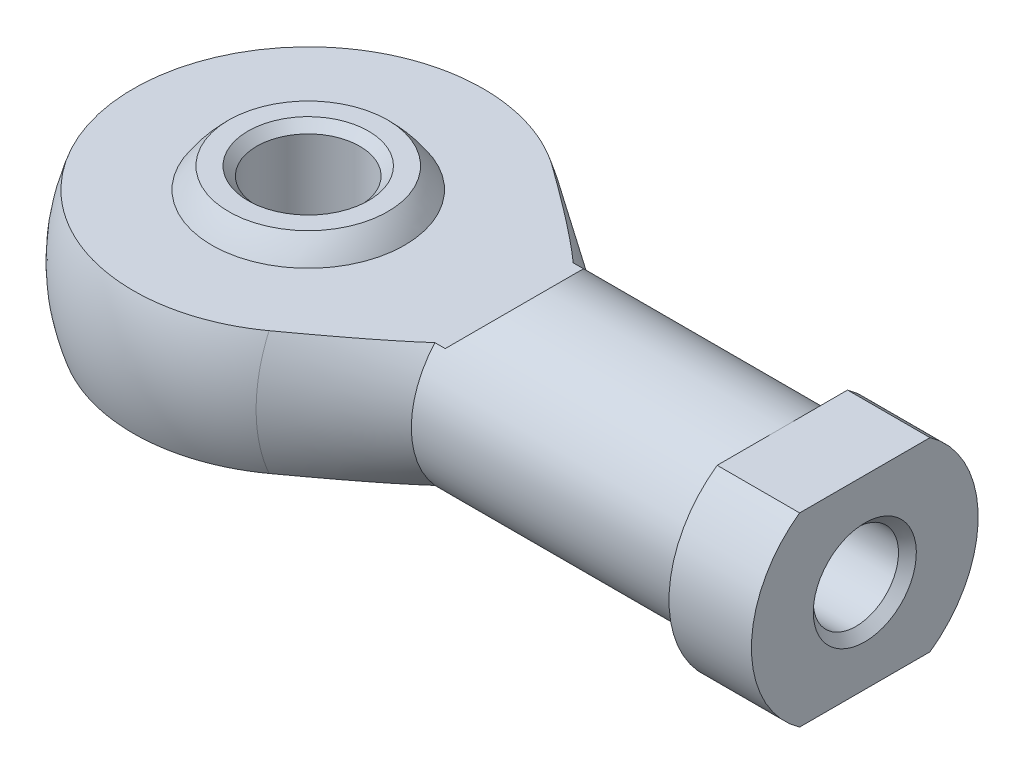
ISO-10303-21;
HEADER;
FILE_DESCRIPTION(('STEP AP214'),'2;1');
FILE_NAME('part.step','',(''),(''),'','','');
FILE_SCHEMA(('AUTOMOTIVE_DESIGN { 1 0 10303 214 1 1 1 1 }'));
ENDSEC;
DATA;
#1=APPLICATION_CONTEXT('core data for automotive mechanical design processes');
#2=APPLICATION_PROTOCOL_DEFINITION('international standard','automotive_design',2000,#1);
#3=PRODUCT_CONTEXT('',#1,'mechanical');
#4=PRODUCT('Part','Part','',(#3));
#5=PRODUCT_RELATED_PRODUCT_CATEGORY('part','',(#4));
#6=PRODUCT_DEFINITION_FORMATION('','',#4);
#7=PRODUCT_DEFINITION_CONTEXT('part definition',#1,'design');
#8=PRODUCT_DEFINITION('design','',#6,#7);
#9=PRODUCT_DEFINITION_SHAPE('','',#8);
#10=(LENGTH_UNIT() NAMED_UNIT(*) SI_UNIT(.MILLI.,.METRE.));
#11=(NAMED_UNIT(*) PLANE_ANGLE_UNIT() SI_UNIT($,.RADIAN.));
#12=(NAMED_UNIT(*) SI_UNIT($,.STERADIAN.) SOLID_ANGLE_UNIT());
#13=UNCERTAINTY_MEASURE_WITH_UNIT(LENGTH_MEASURE(1.E-05),#10,'distance_accuracy_value','');
#14=(GEOMETRIC_REPRESENTATION_CONTEXT(3) GLOBAL_UNCERTAINTY_ASSIGNED_CONTEXT((#13)) GLOBAL_UNIT_ASSIGNED_CONTEXT((#10,
#11,#12)) REPRESENTATION_CONTEXT('',''));
#15=CARTESIAN_POINT('',(0.,0.,0.));
#16=DIRECTION('',(0.,0.,1.));
#17=DIRECTION('',(1.,0.,0.));
#18=AXIS2_PLACEMENT_3D('',#15,#16,#17);
#19=CARTESIAN_POINT('',(16.25,0.,0.));
#20=DIRECTION('',(-1.,0.,0.));
#21=DIRECTION('',(0.,1.,0.));
#22=AXIS2_PLACEMENT_3D('',#19,#20,#21);
#23=CYLINDRICAL_SURFACE('',#22,4.5);
#24=CARTESIAN_POINT('',(7.,0.,0.));
#25=DIRECTION('',(0.707106781186547,0.707106781186548,0.));
#26=DIRECTION('',(-0.707106781186548,0.707106781186547,0.));
#27=AXIS2_PLACEMENT_3D('',#24,#25,#26);
#28=ELLIPSE('',#27,6.36396103067893,4.5);
#29=CARTESIAN_POINT('',(10.,-3.,3.35410196624968));
#30=VERTEX_POINT('',#29);
#31=CARTESIAN_POINT('',(10.,-3.,-3.35410196624968));
#32=VERTEX_POINT('',#31);
#33=EDGE_CURVE('E11',#30,#32,#28,.T.);
#34=ORIENTED_EDGE('',*,*,#33,.T.);
#35=DIRECTION('',(-1.,0.,0.));
#36=VECTOR('',#35,1.);
#37=CARTESIAN_POINT('',(9.74999999999984,-3.,-3.35410196624968));
#38=LINE('',#37,#36);
#39=CARTESIAN_POINT('',(9.5,-3.,-3.35410196624968));
#40=VERTEX_POINT('',#39);
#41=EDGE_CURVE('E27',#32,#40,#38,.T.);
#42=ORIENTED_EDGE('',*,*,#41,.T.);
#43=CARTESIAN_POINT('',(9.5,0.,0.));
#44=DIRECTION('',(-1.,0.,0.));
#45=DIRECTION('',(0.,1.,0.));
#46=AXIS2_PLACEMENT_3D('',#43,#44,#45);
#47=CIRCLE('',#46,4.5);
#48=CARTESIAN_POINT('',(9.5,3.,-3.35410196624968));
#49=VERTEX_POINT('',#48);
#50=EDGE_CURVE('E276',#49,#40,#47,.T.);
#51=ORIENTED_EDGE('',*,*,#50,.F.);
#52=DIRECTION('',(1.,0.,0.));
#53=VECTOR('',#52,1.);
#54=CARTESIAN_POINT('',(9.74999999999984,3.,-3.35410196624968));
#55=LINE('',#54,#53);
#56=CARTESIAN_POINT('',(10.,3.,-3.35410196624968));
#57=VERTEX_POINT('',#56);
#58=EDGE_CURVE('E277',#49,#57,#55,.T.);
#59=ORIENTED_EDGE('',*,*,#58,.T.);
#60=CARTESIAN_POINT('',(7.,0.,0.));
#61=DIRECTION('',(0.707106781186547,-0.707106781186548,0.));
#62=DIRECTION('',(0.707106781186548,0.707106781186547,0.));
#63=AXIS2_PLACEMENT_3D('',#60,#61,#62);
#64=ELLIPSE('',#63,6.36396103067893,4.5);
#65=CARTESIAN_POINT('',(10.,3.,3.35410196624968));
#66=VERTEX_POINT('',#65);
#67=EDGE_CURVE('E284',#57,#66,#64,.T.);
#68=ORIENTED_EDGE('',*,*,#67,.T.);
#69=DIRECTION('',(-1.,0.,0.));
#70=VECTOR('',#69,1.);
#71=CARTESIAN_POINT('',(9.74999999999984,3.,3.35410196624968));
#72=LINE('',#71,#70);
#73=CARTESIAN_POINT('',(9.5,3.,3.35410196624968));
#74=VERTEX_POINT('',#73);
#75=EDGE_CURVE('E166',#66,#74,#72,.T.);
#76=ORIENTED_EDGE('',*,*,#75,.T.);
#77=CARTESIAN_POINT('',(9.5,0.,0.));
#78=DIRECTION('',(-1.,0.,0.));
#79=DIRECTION('',(0.,1.,0.));
#80=AXIS2_PLACEMENT_3D('',#77,#78,#79);
#81=CIRCLE('',#80,4.5);
#82=CARTESIAN_POINT('',(9.5,-3.,3.35410196624968));
#83=VERTEX_POINT('',#82);
#84=EDGE_CURVE('E163',#83,#74,#81,.T.);
#85=ORIENTED_EDGE('',*,*,#84,.F.);
#86=DIRECTION('',(1.,0.,0.));
#87=VECTOR('',#86,1.);
#88=CARTESIAN_POINT('',(9.74999999999984,-3.,3.35410196624968));
#89=LINE('',#88,#87);
#90=EDGE_CURVE('E158',#83,#30,#89,.T.);
#91=ORIENTED_EDGE('',*,*,#90,.T.);
#92=EDGE_LOOP('',(#34,#42,#51,#59,#68,#76,#85,#91));
#93=FACE_BOUND('',#92,.T.);
#94=CARTESIAN_POINT('',(23.,0.,0.));
#95=DIRECTION('',(-1.,0.,0.));
#96=DIRECTION('',(0.,1.,0.));
#97=AXIS2_PLACEMENT_3D('',#94,#95,#96);
#98=CIRCLE('',#97,4.5);
#99=CARTESIAN_POINT('',(23.,4.5,0.));
#100=VERTEX_POINT('',#99);
#101=CARTESIAN_POINT('',(23.,-4.5,0.));
#102=VERTEX_POINT('',#101);
#103=EDGE_CURVE('E181',#100,#102,#98,.T.);
#104=ORIENTED_EDGE('',*,*,#103,.T.);
#105=CARTESIAN_POINT('',(23.,0.,0.));
#106=DIRECTION('',(-1.,0.,0.));
#107=DIRECTION('',(0.,1.,0.));
#108=AXIS2_PLACEMENT_3D('',#105,#106,#107);
#109=CIRCLE('',#108,4.5);
#110=EDGE_CURVE('E336',#102,#100,#109,.T.);
#111=ORIENTED_EDGE('',*,*,#110,.T.);
#112=EDGE_LOOP('',(#104,#111));
#113=FACE_BOUND('',#112,.T.);
#114=ADVANCED_FACE('F16',(#93,#113),#23,.T.);
#115=CARTESIAN_POINT('',(0.,0.,0.));
#116=DIRECTION('',(0.,0.,1.));
#117=DIRECTION('',(1.,0.,0.));
#118=AXIS2_PLACEMENT_3D('',#115,#116,#117);
#119=SPHERICAL_SURFACE('',#118,9.);
#120=CARTESIAN_POINT('',(4.97311036247235,0.,0.));
#121=DIRECTION('',(-1.,0.,0.));
#122=DIRECTION('',(0.,1.,0.));
#123=AXIS2_PLACEMENT_3D('',#120,#121,#122);
#124=CIRCLE('',#123,7.50121145700282);
#125=CARTESIAN_POINT('',(4.97311036247235,3.,-6.87518533005986));
#126=VERTEX_POINT('',#125);
#127=CARTESIAN_POINT('',(4.97311036247235,-3.,-6.87518533005986));
#128=VERTEX_POINT('',#127);
#129=EDGE_CURVE('E340',#126,#128,#124,.T.);
#130=ORIENTED_EDGE('',*,*,#129,.T.);
#131=CARTESIAN_POINT('',(0.,-3.,0.));
#132=DIRECTION('',(0.,1.,0.));
#133=DIRECTION('',(0.,0.,-1.));
#134=AXIS2_PLACEMENT_3D('',#131,#132,#133);
#135=CIRCLE('',#134,8.48528137423858);
#136=CARTESIAN_POINT('',(4.97311036247235,-3.,6.87518533005986));
#137=VERTEX_POINT('',#136);
#138=EDGE_CURVE('E217',#128,#137,#135,.T.);
#139=ORIENTED_EDGE('',*,*,#138,.T.);
#140=CARTESIAN_POINT('',(4.97311036247235,0.,0.));
#141=DIRECTION('',(-1.,0.,0.));
#142=DIRECTION('',(0.,1.,0.));
#143=AXIS2_PLACEMENT_3D('',#140,#141,#142);
#144=CIRCLE('',#143,7.50121145700282);
#145=CARTESIAN_POINT('',(4.97311036247235,3.,6.87518533005986));
#146=VERTEX_POINT('',#145);
#147=EDGE_CURVE('E185',#137,#146,#144,.T.);
#148=ORIENTED_EDGE('',*,*,#147,.T.);
#149=CARTESIAN_POINT('',(0.,3.,0.));
#150=DIRECTION('',(0.,-1.,0.));
#151=DIRECTION('',(0.,0.,1.));
#152=AXIS2_PLACEMENT_3D('',#149,#150,#151);
#153=CIRCLE('',#152,8.48528137423858);
#154=EDGE_CURVE('E218',#146,#126,#153,.T.);
#155=ORIENTED_EDGE('',*,*,#154,.T.);
#156=EDGE_LOOP('',(#130,#139,#148,#155));
#157=FACE_BOUND('',#156,.T.);
#158=ADVANCED_FACE('F388',(#157),#119,.T.);
#159=CARTESIAN_POINT('',(0.,-3.78786796564404,0.));
#160=DIRECTION('',(0.,-1.,0.));
#161=DIRECTION('',(1.,0.,0.));
#162=AXIS2_PLACEMENT_3D('',#159,#160,#161);
#163=CONICAL_SURFACE('',#162,2.71213203435596,0.785398163397448);
#164=CARTESIAN_POINT('',(0.,-3.57573593128807,0.));
#165=DIRECTION('',(0.,1.,0.));
#166=DIRECTION('',(1.,0.,0.));
#167=AXIS2_PLACEMENT_3D('',#164,#165,#166);
#168=CIRCLE('',#167,2.5);
#169=CARTESIAN_POINT('',(-2.5,-3.57573593128807,0.));
#170=VERTEX_POINT('',#169);
#171=EDGE_CURVE('E310',#170,#170,#168,.T.);
#172=ORIENTED_EDGE('',*,*,#171,.T.);
#173=EDGE_LOOP('',(#172));
#174=FACE_BOUND('',#173,.T.);
#175=CARTESIAN_POINT('',(0.,-4.,0.));
#176=DIRECTION('',(0.,1.,0.));
#177=DIRECTION('',(1.,0.,0.));
#178=AXIS2_PLACEMENT_3D('',#175,#176,#177);
#179=CIRCLE('',#178,2.92426406871193);
#180=CARTESIAN_POINT('',(-2.92426406871193,-4.,0.));
#181=VERTEX_POINT('',#180);
#182=EDGE_CURVE('E269',#181,#181,#179,.T.);
#183=ORIENTED_EDGE('',*,*,#182,.F.);
#184=EDGE_LOOP('',(#183));
#185=FACE_BOUND('',#184,.T.);
#186=ADVANCED_FACE('F383',(#174,#185),#163,.F.);
#187=CARTESIAN_POINT('',(0.,0.,0.));
#188=DIRECTION('',(0.,1.,0.));
#189=DIRECTION('',(1.,0.,0.));
#190=AXIS2_PLACEMENT_3D('',#187,#188,#189);
#191=CYLINDRICAL_SURFACE('',#190,2.5);
#192=CARTESIAN_POINT('',(0.,3.57573593128807,0.));
#193=DIRECTION('',(0.,1.,0.));
#194=DIRECTION('',(1.,0.,0.));
#195=AXIS2_PLACEMENT_3D('',#192,#193,#194);
#196=CIRCLE('',#195,2.5);
#197=CARTESIAN_POINT('',(-2.5,3.57573593128807,0.));
#198=VERTEX_POINT('',#197);
#199=EDGE_CURVE('E255',#198,#198,#196,.T.);
#200=ORIENTED_EDGE('',*,*,#199,.T.);
#201=EDGE_LOOP('',(#200));
#202=FACE_BOUND('',#201,.T.);
#203=ORIENTED_EDGE('',*,*,#171,.F.);
#204=EDGE_LOOP('',(#203));
#205=FACE_BOUND('',#204,.T.);
#206=ADVANCED_FACE('F367',(#202,#205),#191,.F.);
#207=CARTESIAN_POINT('',(0.,3.78786796564403,0.));
#208=DIRECTION('',(0.,1.,0.));
#209=DIRECTION('',(1.,0.,0.));
#210=AXIS2_PLACEMENT_3D('',#207,#208,#209);
#211=CONICAL_SURFACE('',#210,2.71213203435596,0.785398163397449);
#212=CARTESIAN_POINT('',(0.,4.,0.));
#213=DIRECTION('',(0.,1.,0.));
#214=DIRECTION('',(1.,0.,0.));
#215=AXIS2_PLACEMENT_3D('',#212,#213,#214);
#216=CIRCLE('',#215,2.92426406871192);
#217=CARTESIAN_POINT('',(-2.92426406871192,4.,0.));
#218=VERTEX_POINT('',#217);
#219=EDGE_CURVE('E223',#218,#218,#216,.T.);
#220=ORIENTED_EDGE('',*,*,#219,.T.);
#221=EDGE_LOOP('',(#220));
#222=FACE_BOUND('',#221,.T.);
#223=ORIENTED_EDGE('',*,*,#199,.F.);
#224=EDGE_LOOP('',(#223));
#225=FACE_BOUND('',#224,.T.);
#226=ADVANCED_FACE('F370',(#222,#225),#211,.F.);
#227=CARTESIAN_POINT('',(13.4033084967925,0.,0.));
#228=DIRECTION('',(1.,0.,0.));
#229=DIRECTION('',(0.,1.,0.));
#230=AXIS2_PLACEMENT_3D('',#227,#228,#229);
#231=CONICAL_SURFACE('',#230,1.0335,1.0471975511966);
#232=CARTESIAN_POINT('',(14.,0.,0.));
#233=DIRECTION('',(-1.,0.,0.));
#234=DIRECTION('',(0.,1.,0.));
#235=AXIS2_PLACEMENT_3D('',#232,#233,#234);
#236=CIRCLE('',#235,2.067);
#237=CARTESIAN_POINT('',(14.,2.067,0.));
#238=VERTEX_POINT('',#237);
#239=EDGE_CURVE('E219',#238,#238,#236,.T.);
#240=ORIENTED_EDGE('',*,*,#239,.F.);
#241=EDGE_LOOP('',(#240));
#242=FACE_BOUND('',#241,.T.);
#243=CARTESIAN_POINT('',(12.806616993585,0.,0.));
#244=VERTEX_POINT('',#243);
#245=VERTEX_LOOP('',#244);
#246=FACE_BOUND('',#245,.T.);
#247=ADVANCED_FACE('F372',(#242,#246),#231,.F.);
#248=CARTESIAN_POINT('',(20.2835,0.,0.));
#249=DIRECTION('',(-1.,0.,0.));
#250=DIRECTION('',(0.,1.,0.));
#251=AXIS2_PLACEMENT_3D('',#248,#249,#250);
#252=CYLINDRICAL_SURFACE('',#251,2.067);
#253=CARTESIAN_POINT('',(26.567,0.,0.));
#254=DIRECTION('',(-1.,0.,0.));
#255=DIRECTION('',(0.,1.,0.));
#256=AXIS2_PLACEMENT_3D('',#253,#254,#255);
#257=CIRCLE('',#256,2.067);
#258=CARTESIAN_POINT('',(26.567,-2.067,0.));
#259=VERTEX_POINT('',#258);
#260=EDGE_CURVE('E224',#259,#259,#257,.T.);
#261=ORIENTED_EDGE('',*,*,#260,.F.);
#262=EDGE_LOOP('',(#261));
#263=FACE_BOUND('',#262,.T.);
#264=ORIENTED_EDGE('',*,*,#239,.T.);
#265=EDGE_LOOP('',(#264));
#266=FACE_BOUND('',#265,.T.);
#267=ADVANCED_FACE('F380',(#263,#266),#252,.F.);
#268=CARTESIAN_POINT('',(26.7835,0.,0.));
#269=DIRECTION('',(1.,0.,0.));
#270=DIRECTION('',(0.,1.,0.));
#271=AXIS2_PLACEMENT_3D('',#268,#269,#270);
#272=CONICAL_SURFACE('',#271,2.2835,0.785398163397448);
#273=CARTESIAN_POINT('',(27.,0.,0.));
#274=DIRECTION('',(-1.,0.,0.));
#275=DIRECTION('',(0.,1.,0.));
#276=AXIS2_PLACEMENT_3D('',#273,#274,#275);
#277=CIRCLE('',#276,2.5);
#278=CARTESIAN_POINT('',(27.,-2.5,0.));
#279=VERTEX_POINT('',#278);
#280=EDGE_CURVE('E225',#279,#279,#277,.T.);
#281=ORIENTED_EDGE('',*,*,#280,.F.);
#282=EDGE_LOOP('',(#281));
#283=FACE_BOUND('',#282,.T.);
#284=ORIENTED_EDGE('',*,*,#260,.T.);
#285=EDGE_LOOP('',(#284));
#286=FACE_BOUND('',#285,.T.);
#287=ADVANCED_FACE('F397',(#283,#286),#272,.F.);
#288=CARTESIAN_POINT('',(27.,-4.5,-6.5));
#289=DIRECTION('',(0.,1.,0.));
#290=DIRECTION('',(1.,0.,0.));
#291=AXIS2_PLACEMENT_3D('',#288,#289,#290);
#292=PLANE('',#291);
#293=DIRECTION('',(-1.,0.,0.));
#294=VECTOR('',#293,1.);
#295=CARTESIAN_POINT('',(25.,-4.5,-3.16227766016838));
#296=LINE('',#295,#294);
#297=CARTESIAN_POINT('',(27.,-4.5,-3.16227766016838));
#298=VERTEX_POINT('',#297);
#299=CARTESIAN_POINT('',(23.,-4.5,-3.16227766016838));
#300=VERTEX_POINT('',#299);
#301=EDGE_CURVE('E230',#298,#300,#296,.T.);
#302=ORIENTED_EDGE('',*,*,#301,.F.);
#303=DIRECTION('',(0.,0.,-1.));
#304=VECTOR('',#303,1.);
#305=CARTESIAN_POINT('',(27.,-4.5,-3.25));
#306=LINE('',#305,#304);
#307=CARTESIAN_POINT('',(27.,-4.5,3.16227766016838));
#308=VERTEX_POINT('',#307);
#309=EDGE_CURVE('E261',#308,#298,#306,.T.);
#310=ORIENTED_EDGE('',*,*,#309,.F.);
#311=DIRECTION('',(1.,0.,0.));
#312=VECTOR('',#311,1.);
#313=CARTESIAN_POINT('',(25.,-4.5,3.16227766016838));
#314=LINE('',#313,#312);
#315=CARTESIAN_POINT('',(23.,-4.5,3.16227766016838));
#316=VERTEX_POINT('',#315);
#317=EDGE_CURVE('E252',#316,#308,#314,.T.);
#318=ORIENTED_EDGE('',*,*,#317,.F.);
#319=DIRECTION('',(0.,0.,1.));
#320=VECTOR('',#319,1.);
#321=CARTESIAN_POINT('',(23.,-4.5,-3.25));
#322=LINE('',#321,#320);
#323=EDGE_CURVE('E349',#102,#316,#322,.T.);
#324=ORIENTED_EDGE('',*,*,#323,.F.);
#325=DIRECTION('',(0.,0.,1.));
#326=VECTOR('',#325,1.);
#327=CARTESIAN_POINT('',(23.,-4.5,-3.25));
#328=LINE('',#327,#326);
#329=EDGE_CURVE('E240',#300,#102,#328,.T.);
#330=ORIENTED_EDGE('',*,*,#329,.F.);
#331=EDGE_LOOP('',(#302,#310,#318,#324,#330));
#332=FACE_BOUND('',#331,.T.);
#333=ADVANCED_FACE('F412',(#332),#292,.F.);
#334=CARTESIAN_POINT('',(27.,4.5,6.5));
#335=DIRECTION('',(0.,-1.,0.));
#336=DIRECTION('',(0.,0.,-1.));
#337=AXIS2_PLACEMENT_3D('',#334,#335,#336);
#338=PLANE('',#337);
#339=DIRECTION('',(-1.,0.,0.));
#340=VECTOR('',#339,1.);
#341=CARTESIAN_POINT('',(25.,4.5,3.16227766016838));
#342=LINE('',#341,#340);
#343=CARTESIAN_POINT('',(27.,4.5,3.16227766016838));
#344=VERTEX_POINT('',#343);
#345=CARTESIAN_POINT('',(23.,4.5,3.16227766016838));
#346=VERTEX_POINT('',#345);
#347=EDGE_CURVE('E291',#344,#346,#342,.T.);
#348=ORIENTED_EDGE('',*,*,#347,.F.);
#349=DIRECTION('',(0.,0.,1.));
#350=VECTOR('',#349,1.);
#351=CARTESIAN_POINT('',(27.,4.5,3.25));
#352=LINE('',#351,#350);
#353=CARTESIAN_POINT('',(27.,4.5,-3.16227766016838));
#354=VERTEX_POINT('',#353);
#355=EDGE_CURVE('E229',#354,#344,#352,.T.);
#356=ORIENTED_EDGE('',*,*,#355,.F.);
#357=DIRECTION('',(1.,0.,0.));
#358=VECTOR('',#357,1.);
#359=CARTESIAN_POINT('',(25.,4.5,-3.16227766016838));
#360=LINE('',#359,#358);
#361=CARTESIAN_POINT('',(23.,4.5,-3.16227766016838));
#362=VERTEX_POINT('',#361);
#363=EDGE_CURVE('E302',#362,#354,#360,.T.);
#364=ORIENTED_EDGE('',*,*,#363,.F.);
#365=DIRECTION('',(0.,0.,-1.));
#366=VECTOR('',#365,1.);
#367=CARTESIAN_POINT('',(23.,4.5,3.25));
#368=LINE('',#367,#366);
#369=EDGE_CURVE('E233',#100,#362,#368,.T.);
#370=ORIENTED_EDGE('',*,*,#369,.F.);
#371=DIRECTION('',(0.,0.,-1.));
#372=VECTOR('',#371,1.);
#373=CARTESIAN_POINT('',(23.,4.5,3.25));
#374=LINE('',#373,#372);
#375=EDGE_CURVE('E257',#346,#100,#374,.T.);
#376=ORIENTED_EDGE('',*,*,#375,.F.);
#377=EDGE_LOOP('',(#348,#356,#364,#370,#376));
#378=FACE_BOUND('',#377,.T.);
#379=ADVANCED_FACE('F409',(#378),#338,.F.);
#380=CARTESIAN_POINT('',(23.,5.,0.));
#381=DIRECTION('',(-1.,0.,0.));
#382=DIRECTION('',(0.,0.,1.));
#383=AXIS2_PLACEMENT_3D('',#380,#381,#382);
#384=PLANE('',#383);
#385=ORIENTED_EDGE('',*,*,#323,.T.);
#386=CARTESIAN_POINT('',(23.,0.,0.));
#387=DIRECTION('',(-1.,0.,0.));
#388=DIRECTION('',(0.,1.,0.));
#389=AXIS2_PLACEMENT_3D('',#386,#387,#388);
#390=CIRCLE('',#389,5.5);
#391=EDGE_CURVE('E200',#316,#346,#390,.T.);
#392=ORIENTED_EDGE('',*,*,#391,.T.);
#393=ORIENTED_EDGE('',*,*,#375,.T.);
#394=ORIENTED_EDGE('',*,*,#110,.F.);
#395=EDGE_LOOP('',(#385,#392,#393,#394));
#396=FACE_BOUND('',#395,.T.);
#397=ADVANCED_FACE('F411',(#396),#384,.T.);
#398=CARTESIAN_POINT('',(25.,0.,0.));
#399=DIRECTION('',(-1.,0.,0.));
#400=DIRECTION('',(0.,1.,0.));
#401=AXIS2_PLACEMENT_3D('',#398,#399,#400);
#402=CYLINDRICAL_SURFACE('',#401,5.5);
#403=ORIENTED_EDGE('',*,*,#317,.T.);
#404=CARTESIAN_POINT('',(27.,0.,0.));
#405=DIRECTION('',(-1.,0.,0.));
#406=DIRECTION('',(0.,1.,0.));
#407=AXIS2_PLACEMENT_3D('',#404,#405,#406);
#408=CIRCLE('',#407,5.5);
#409=EDGE_CURVE('E287',#308,#344,#408,.T.);
#410=ORIENTED_EDGE('',*,*,#409,.T.);
#411=ORIENTED_EDGE('',*,*,#347,.T.);
#412=ORIENTED_EDGE('',*,*,#391,.F.);
#413=EDGE_LOOP('',(#403,#410,#411,#412));
#414=FACE_BOUND('',#413,.T.);
#415=ADVANCED_FACE('F415',(#414),#402,.T.);
#416=CARTESIAN_POINT('',(0.,0.,0.));
#417=DIRECTION('',(0.,0.,1.));
#418=DIRECTION('',(1.,0.,0.));
#419=AXIS2_PLACEMENT_3D('',#416,#417,#418);
#420=SPHERICAL_SURFACE('',#419,5.555);
#421=CARTESIAN_POINT('',(0.,0.,0.));
#422=DIRECTION('',(0.,1.,0.));
#423=DIRECTION('',(0.,0.,1.));
#424=AXIS2_PLACEMENT_3D('',#421,#422,#423);
#425=SPHERICAL_SURFACE('',#424,5.555);
#426=CARTESIAN_POINT('',(0.,-3.,0.));
#427=DIRECTION('',(0.,1.,0.));
#428=DIRECTION('',(0.,0.,1.));
#429=AXIS2_PLACEMENT_3D('',#426,#427,#428);
#430=CIRCLE('',#429,4.67525667744564);
#431=CARTESIAN_POINT('',(0.,-3.,4.67525667744564));
#432=VERTEX_POINT('',#431);
#433=EDGE_CURVE('E270',#432,#432,#430,.T.);
#434=ORIENTED_EDGE('',*,*,#433,.F.);
#435=EDGE_LOOP('',(#434));
#436=FACE_BOUND('',#435,.T.);
#437=CARTESIAN_POINT('',(0.,-4.,0.));
#438=DIRECTION('',(0.,1.,0.));
#439=DIRECTION('',(1.,0.,0.));
#440=AXIS2_PLACEMENT_3D('',#437,#438,#439);
#441=CIRCLE('',#440,3.85461087530246);
#442=CARTESIAN_POINT('',(-3.85461087530246,-4.,0.));
#443=VERTEX_POINT('',#442);
#444=EDGE_CURVE('E20',#443,#443,#441,.T.);
#445=ORIENTED_EDGE('',*,*,#444,.T.);
#446=EDGE_LOOP('',(#445));
#447=FACE_BOUND('',#446,.T.);
#448=ADVANCED_FACE('F418',(#436,#447),#425,.T.);
#449=CARTESIAN_POINT('',(3.38943747200719,-4.,0.));
#450=DIRECTION('',(0.,-1.,0.));
#451=DIRECTION('',(0.,0.,-1.));
#452=AXIS2_PLACEMENT_3D('',#449,#450,#451);
#453=PLANE('',#452);
#454=ORIENTED_EDGE('',*,*,#444,.F.);
#455=EDGE_LOOP('',(#454));
#456=FACE_BOUND('',#455,.T.);
#457=ORIENTED_EDGE('',*,*,#182,.T.);
#458=EDGE_LOOP('',(#457));
#459=FACE_BOUND('',#458,.T.);
#460=ADVANCED_FACE('F402',(#456,#459),#453,.T.);
#461=CARTESIAN_POINT('',(0.,0.,0.));
#462=DIRECTION('',(0.,0.,1.));
#463=DIRECTION('',(1.,0.,0.));
#464=AXIS2_PLACEMENT_3D('',#461,#462,#463);
#465=SPHERICAL_SURFACE('',#464,5.555);
#466=CARTESIAN_POINT('',(0.,0.,0.));
#467=DIRECTION('',(0.,-1.,0.));
#468=DIRECTION('',(0.,0.,-1.));
#469=AXIS2_PLACEMENT_3D('',#466,#467,#468);
#470=SPHERICAL_SURFACE('',#469,5.555);
#471=CARTESIAN_POINT('',(0.,3.,0.));
#472=DIRECTION('',(0.,-1.,0.));
#473=DIRECTION('',(0.,0.,-1.));
#474=AXIS2_PLACEMENT_3D('',#471,#472,#473);
#475=CIRCLE('',#474,4.67525667744564);
#476=CARTESIAN_POINT('',(0.,3.,-4.67525667744564));
#477=VERTEX_POINT('',#476);
#478=EDGE_CURVE('E188',#477,#477,#475,.T.);
#479=ORIENTED_EDGE('',*,*,#478,.F.);
#480=EDGE_LOOP('',(#479));
#481=FACE_BOUND('',#480,.T.);
#482=CARTESIAN_POINT('',(0.,4.,0.));
#483=DIRECTION('',(0.,1.,0.));
#484=DIRECTION('',(1.,0.,0.));
#485=AXIS2_PLACEMENT_3D('',#482,#483,#484);
#486=CIRCLE('',#485,3.85461087530247);
#487=CARTESIAN_POINT('',(-3.85461087530247,4.,0.));
#488=VERTEX_POINT('',#487);
#489=EDGE_CURVE('E265',#488,#488,#486,.T.);
#490=ORIENTED_EDGE('',*,*,#489,.F.);
#491=EDGE_LOOP('',(#490));
#492=FACE_BOUND('',#491,.T.);
#493=ADVANCED_FACE('F398',(#481,#492),#470,.T.);
#494=CARTESIAN_POINT('',(3.38943747200719,4.,0.));
#495=DIRECTION('',(0.,1.,0.));
#496=DIRECTION('',(1.,0.,0.));
#497=AXIS2_PLACEMENT_3D('',#494,#495,#496);
#498=PLANE('',#497);
#499=ORIENTED_EDGE('',*,*,#489,.T.);
#500=EDGE_LOOP('',(#499));
#501=FACE_BOUND('',#500,.T.);
#502=ORIENTED_EDGE('',*,*,#219,.F.);
#503=EDGE_LOOP('',(#502));
#504=FACE_BOUND('',#503,.T.);
#505=ADVANCED_FACE('F401',(#501,#504),#498,.T.);
#506=CARTESIAN_POINT('',(10.,-3.,10.));
#507=DIRECTION('',(0.,1.,0.));
#508=DIRECTION('',(1.,0.,0.));
#509=AXIS2_PLACEMENT_3D('',#506,#507,#508);
#510=PLANE('',#509);
#511=ORIENTED_EDGE('',*,*,#41,.F.);
#512=DIRECTION('',(0.,0.,-1.));
#513=VECTOR('',#512,1.);
#514=CARTESIAN_POINT('',(10.,-3.,10.));
#515=LINE('',#514,#513);
#516=EDGE_CURVE('E179',#30,#32,#515,.T.);
#517=ORIENTED_EDGE('',*,*,#516,.F.);
#518=ORIENTED_EDGE('',*,*,#90,.F.);
#519=CARTESIAN_POINT('',(4.9731103624718,-3.,6.87518533006026));
#520=CARTESIAN_POINT('',(8.01566888343215,-3.,4.67437493985008));
#521=CARTESIAN_POINT('',(9.50000000000035,-3.,3.3541019662494));
#522=(BOUNDED_CURVE() B_SPLINE_CURVE(2,(#519,#520,#521),.UNSPECIFIED.,.F.,
.F.) B_SPLINE_CURVE_WITH_KNOTS((3,3),(2.07677481882978E-12,5.73664607842455),
.UNSPECIFIED.) CURVE() GEOMETRIC_REPRESENTATION_ITEM() RATIONAL_B_SPLINE_CURVE((1.,
1.0460342814286,1.)) REPRESENTATION_ITEM(''));
#523=EDGE_CURVE('E172',#137,#83,#522,.T.);
#524=ORIENTED_EDGE('',*,*,#523,.F.);
#525=ORIENTED_EDGE('',*,*,#138,.F.);
#526=CARTESIAN_POINT('',(9.50000000000035,-3.,-3.3541019662494));
#527=CARTESIAN_POINT('',(8.01566888343215,-3.,-4.67437493985008));
#528=CARTESIAN_POINT('',(4.9731103624718,-3.,-6.87518533006026));
#529=(BOUNDED_CURVE() B_SPLINE_CURVE(2,(#526,#527,#528),.UNSPECIFIED.,.F.,
.F.) B_SPLINE_CURVE_WITH_KNOTS((3,3),(2.53805575566263E-12,5.73664607842501),
.UNSPECIFIED.) CURVE() GEOMETRIC_REPRESENTATION_ITEM() RATIONAL_B_SPLINE_CURVE((1.,
1.0460342814286,1.)) REPRESENTATION_ITEM(''));
#530=EDGE_CURVE('E202',#40,#128,#529,.T.);
#531=ORIENTED_EDGE('',*,*,#530,.F.);
#532=EDGE_LOOP('',(#511,#517,#518,#524,#525,#531));
#533=FACE_BOUND('',#532,.T.);
#534=ORIENTED_EDGE('',*,*,#433,.T.);
#535=EDGE_LOOP('',(#534));
#536=FACE_BOUND('',#535,.T.);
#537=ADVANCED_FACE('F176',(#533,#536),#510,.F.);
#538=CARTESIAN_POINT('',(10.,3.,10.));
#539=DIRECTION('',(0.707106781186547,-0.707106781186548,0.));
#540=DIRECTION('',(0.,0.,-1.));
#541=AXIS2_PLACEMENT_3D('',#538,#539,#540);
#542=PLANE('',#541);
#543=ORIENTED_EDGE('',*,*,#67,.F.);
#544=DIRECTION('',(0.,0.,-1.));
#545=VECTOR('',#544,1.);
#546=CARTESIAN_POINT('',(10.,3.,10.));
#547=LINE('',#546,#545);
#548=EDGE_CURVE('E195',#66,#57,#547,.T.);
#549=ORIENTED_EDGE('',*,*,#548,.F.);
#550=EDGE_LOOP('',(#543,#549));
#551=FACE_BOUND('',#550,.T.);
#552=ADVANCED_FACE('F404',(#551),#542,.F.);
#553=CARTESIAN_POINT('',(15.,-8.,10.));
#554=DIRECTION('',(0.707106781186547,0.707106781186548,0.));
#555=DIRECTION('',(0.,0.,-1.));
#556=AXIS2_PLACEMENT_3D('',#553,#554,#555);
#557=PLANE('',#556);
#558=ORIENTED_EDGE('',*,*,#33,.F.);
#559=ORIENTED_EDGE('',*,*,#516,.T.);
#560=EDGE_LOOP('',(#558,#559));
#561=FACE_BOUND('',#560,.T.);
#562=ADVANCED_FACE('F406',(#561),#557,.F.);
#563=CARTESIAN_POINT('',(-10.,3.,10.));
#564=DIRECTION('',(0.,-1.,0.));
#565=DIRECTION('',(0.,0.,-1.));
#566=AXIS2_PLACEMENT_3D('',#563,#564,#565);
#567=PLANE('',#566);
#568=ORIENTED_EDGE('',*,*,#58,.F.);
#569=CARTESIAN_POINT('',(4.9731103624718,3.,-6.87518533006026));
#570=CARTESIAN_POINT('',(8.0156688834321,3.,-4.67437493985011));
#571=CARTESIAN_POINT('',(9.50000000000035,3.,-3.3541019662494));
#572=(BOUNDED_CURVE() B_SPLINE_CURVE(2,(#569,#570,#571),.UNSPECIFIED.,.F.,
.F.) B_SPLINE_CURVE_WITH_KNOTS((3,3),(2.07677481882981E-12,5.73664607842455),
.UNSPECIFIED.) CURVE() GEOMETRIC_REPRESENTATION_ITEM() RATIONAL_B_SPLINE_CURVE((1.,
1.04603428142857,1.)) REPRESENTATION_ITEM(''));
#573=EDGE_CURVE('E211',#126,#49,#572,.T.);
#574=ORIENTED_EDGE('',*,*,#573,.F.);
#575=ORIENTED_EDGE('',*,*,#154,.F.);
#576=CARTESIAN_POINT('',(9.50000000000035,3.,3.3541019662494));
#577=CARTESIAN_POINT('',(8.0156688834321,3.,4.67437493985011));
#578=CARTESIAN_POINT('',(4.9731103624718,3.,6.87518533006026));
#579=(BOUNDED_CURVE() B_SPLINE_CURVE(2,(#576,#577,#578),.UNSPECIFIED.,.F.,
.F.) B_SPLINE_CURVE_WITH_KNOTS((3,3),(2.53805575566256E-12,5.73664607842501),
.UNSPECIFIED.) CURVE() GEOMETRIC_REPRESENTATION_ITEM() RATIONAL_B_SPLINE_CURVE((1.,
1.04603428142857,1.)) REPRESENTATION_ITEM(''));
#580=EDGE_CURVE('E173',#74,#146,#579,.T.);
#581=ORIENTED_EDGE('',*,*,#580,.F.);
#582=ORIENTED_EDGE('',*,*,#75,.F.);
#583=ORIENTED_EDGE('',*,*,#548,.T.);
#584=EDGE_LOOP('',(#568,#574,#575,#581,#582,#583));
#585=FACE_BOUND('',#584,.T.);
#586=ORIENTED_EDGE('',*,*,#478,.T.);
#587=EDGE_LOOP('',(#586));
#588=FACE_BOUND('',#587,.T.);
#589=ADVANCED_FACE('F427',(#585,#588),#567,.F.);
#590=CARTESIAN_POINT('',(7.23655518123618,0.,0.));
#591=DIRECTION('',(-1.,0.,0.));
#592=DIRECTION('',(0.,1.,0.));
#593=AXIS2_PLACEMENT_3D('',#590,#591,#592);
#594=CONICAL_SURFACE('',#593,6.00060572850141,0.585441986720822);
#595=ORIENTED_EDGE('',*,*,#523,.T.);
#596=ORIENTED_EDGE('',*,*,#84,.T.);
#597=ORIENTED_EDGE('',*,*,#580,.T.);
#598=ORIENTED_EDGE('',*,*,#147,.F.);
#599=EDGE_LOOP('',(#595,#596,#597,#598));
#600=FACE_BOUND('',#599,.T.);
#601=ADVANCED_FACE('F183',(#600),#594,.T.);
#602=CARTESIAN_POINT('',(27.,2.75,0.));
#603=DIRECTION('',(1.,0.,0.));
#604=DIRECTION('',(0.,1.,0.));
#605=AXIS2_PLACEMENT_3D('',#602,#603,#604);
#606=PLANE('',#605);
#607=ORIENTED_EDGE('',*,*,#309,.T.);
#608=CARTESIAN_POINT('',(27.,0.,0.));
#609=DIRECTION('',(-1.,0.,0.));
#610=DIRECTION('',(0.,1.,0.));
#611=AXIS2_PLACEMENT_3D('',#608,#609,#610);
#612=CIRCLE('',#611,5.5);
#613=EDGE_CURVE('E248',#354,#298,#612,.T.);
#614=ORIENTED_EDGE('',*,*,#613,.F.);
#615=ORIENTED_EDGE('',*,*,#355,.T.);
#616=ORIENTED_EDGE('',*,*,#409,.F.);
#617=EDGE_LOOP('',(#607,#614,#615,#616));
#618=FACE_BOUND('',#617,.T.);
#619=ORIENTED_EDGE('',*,*,#280,.T.);
#620=EDGE_LOOP('',(#619));
#621=FACE_BOUND('',#620,.T.);
#622=ADVANCED_FACE('F438',(#618,#621),#606,.T.);
#623=CARTESIAN_POINT('',(25.,0.,0.));
#624=DIRECTION('',(-1.,0.,0.));
#625=DIRECTION('',(0.,1.,0.));
#626=AXIS2_PLACEMENT_3D('',#623,#624,#625);
#627=CYLINDRICAL_SURFACE('',#626,5.5);
#628=ORIENTED_EDGE('',*,*,#301,.T.);
#629=CARTESIAN_POINT('',(23.,0.,0.));
#630=DIRECTION('',(-1.,0.,0.));
#631=DIRECTION('',(0.,1.,0.));
#632=AXIS2_PLACEMENT_3D('',#629,#630,#631);
#633=CIRCLE('',#632,5.5);
#634=EDGE_CURVE('E210',#362,#300,#633,.T.);
#635=ORIENTED_EDGE('',*,*,#634,.F.);
#636=ORIENTED_EDGE('',*,*,#363,.T.);
#637=ORIENTED_EDGE('',*,*,#613,.T.);
#638=EDGE_LOOP('',(#628,#635,#636,#637));
#639=FACE_BOUND('',#638,.T.);
#640=ADVANCED_FACE('F18',(#639),#627,.T.);
#641=CARTESIAN_POINT('',(23.,5.,0.));
#642=DIRECTION('',(-1.,0.,0.));
#643=DIRECTION('',(0.,0.,1.));
#644=AXIS2_PLACEMENT_3D('',#641,#642,#643);
#645=PLANE('',#644);
#646=ORIENTED_EDGE('',*,*,#329,.T.);
#647=ORIENTED_EDGE('',*,*,#103,.F.);
#648=ORIENTED_EDGE('',*,*,#369,.T.);
#649=ORIENTED_EDGE('',*,*,#634,.T.);
#650=EDGE_LOOP('',(#646,#647,#648,#649));
#651=FACE_BOUND('',#650,.T.);
#652=ADVANCED_FACE('F435',(#651),#645,.T.);
#653=CARTESIAN_POINT('',(7.23655518123618,0.,0.));
#654=DIRECTION('',(-1.,0.,0.));
#655=DIRECTION('',(0.,1.,0.));
#656=AXIS2_PLACEMENT_3D('',#653,#654,#655);
#657=CONICAL_SURFACE('',#656,6.00060572850141,0.585441986720822);
#658=ORIENTED_EDGE('',*,*,#530,.T.);
#659=ORIENTED_EDGE('',*,*,#129,.F.);
#660=ORIENTED_EDGE('',*,*,#573,.T.);
#661=ORIENTED_EDGE('',*,*,#50,.T.);
#662=EDGE_LOOP('',(#658,#659,#660,#661));
#663=FACE_BOUND('',#662,.T.);
#664=ADVANCED_FACE('F432',(#663),#657,.T.);
#665=CLOSED_SHELL('',(#114,#158,#186,#206,#226,#247,#267,#287,#333,#379,#397,#415,#448,#460,
#493,#505,#537,#552,#562,#589,#601,#622,#640,#652,#664));
#666=MANIFOLD_SOLID_BREP('B1',#665);
#667=ADVANCED_BREP_SHAPE_REPRESENTATION('',(#18,#666),#14);
#668=SHAPE_DEFINITION_REPRESENTATION(#9,#667);
ENDSEC;
END-ISO-10303-21;
